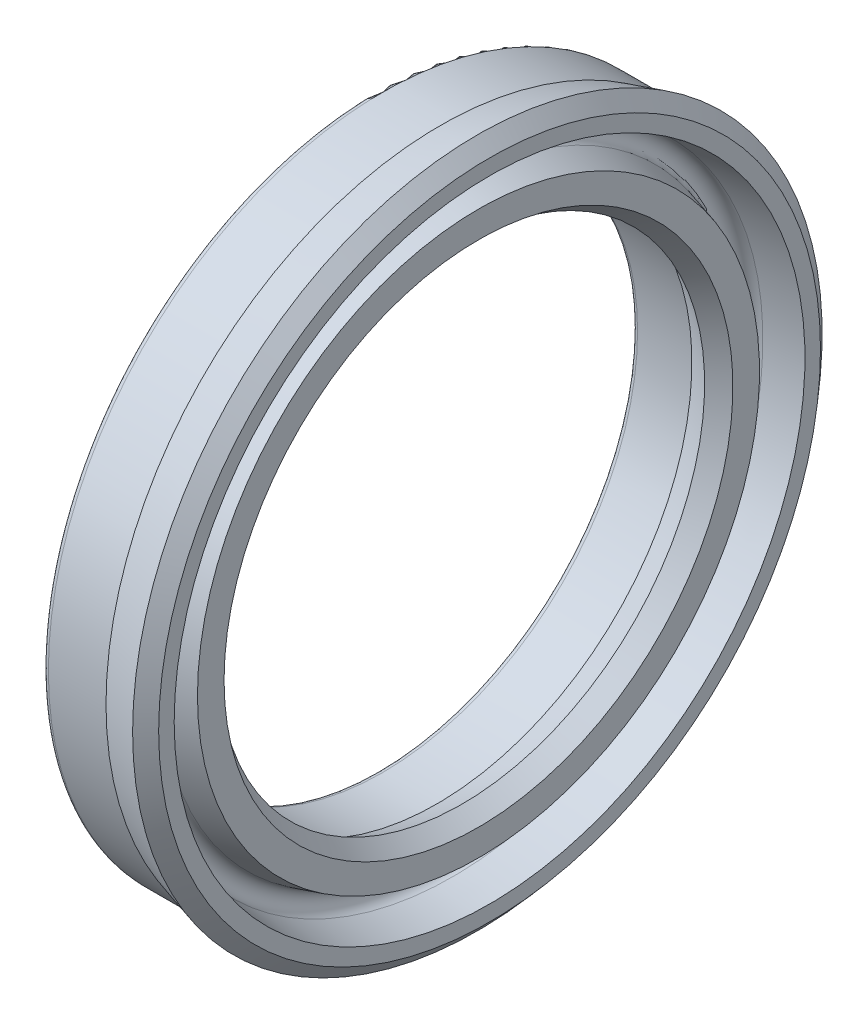
ISO-10303-21;
HEADER;
FILE_DESCRIPTION(('STEP AP214'),'2;1');
FILE_NAME('part.step','',(''),(''),'','','');
FILE_SCHEMA(('AUTOMOTIVE_DESIGN { 1 0 10303 214 1 1 1 1 }'));
ENDSEC;
DATA;
#1=APPLICATION_CONTEXT('core data for automotive mechanical design processes');
#2=APPLICATION_PROTOCOL_DEFINITION('international standard','automotive_design',2000,#1);
#3=PRODUCT_CONTEXT('',#1,'mechanical');
#4=PRODUCT('Part','Part','',(#3));
#5=PRODUCT_RELATED_PRODUCT_CATEGORY('part','',(#4));
#6=PRODUCT_DEFINITION_FORMATION('','',#4);
#7=PRODUCT_DEFINITION_CONTEXT('part definition',#1,'design');
#8=PRODUCT_DEFINITION('design','',#6,#7);
#9=PRODUCT_DEFINITION_SHAPE('','',#8);
#10=(LENGTH_UNIT() NAMED_UNIT(*) SI_UNIT(.MILLI.,.METRE.));
#11=(NAMED_UNIT(*) PLANE_ANGLE_UNIT() SI_UNIT($,.RADIAN.));
#12=(NAMED_UNIT(*) SI_UNIT($,.STERADIAN.) SOLID_ANGLE_UNIT());
#13=UNCERTAINTY_MEASURE_WITH_UNIT(LENGTH_MEASURE(1.E-05),#10,'distance_accuracy_value','');
#14=(GEOMETRIC_REPRESENTATION_CONTEXT(3) GLOBAL_UNCERTAINTY_ASSIGNED_CONTEXT((#13)) GLOBAL_UNIT_ASSIGNED_CONTEXT((#10,
#11,#12)) REPRESENTATION_CONTEXT('',''));
#15=CARTESIAN_POINT('',(0.,0.,0.));
#16=DIRECTION('',(0.,0.,1.));
#17=DIRECTION('',(1.,0.,0.));
#18=AXIS2_PLACEMENT_3D('',#15,#16,#17);
#19=CARTESIAN_POINT('',(6.81360939076159,0.,0.));
#20=DIRECTION('',(1.,0.,0.));
#21=DIRECTION('',(0.,0.,-1.));
#22=AXIS2_PLACEMENT_3D('',#19,#20,#21);
#23=CONICAL_SURFACE('',#22,27.9906551376294,0.136817054183385);
#24=CARTESIAN_POINT('',(10.1500000000001,0.,0.));
#25=DIRECTION('',(-1.,0.,0.));
#26=DIRECTION('',(0.,0.,1.));
#27=AXIS2_PLACEMENT_3D('',#24,#25,#26);
#28=CIRCLE('',#27,28.45);
#29=CARTESIAN_POINT('',(10.1500000000001,0.,28.4500000000001));
#30=VERTEX_POINT('',#29);
#31=EDGE_CURVE('E86',#30,#30,#28,.T.);
#32=ORIENTED_EDGE('',*,*,#31,.F.);
#33=EDGE_LOOP('',(#32));
#34=FACE_BOUND('',#33,.T.);
#35=CARTESIAN_POINT('',(6.81360939076159,0.,0.));
#36=DIRECTION('',(-1.,0.,0.));
#37=DIRECTION('',(0.,0.,1.));
#38=AXIS2_PLACEMENT_3D('',#35,#36,#37);
#39=CIRCLE('',#38,27.9906551376294);
#40=CARTESIAN_POINT('',(6.81360939076159,0.,27.9906551376295));
#41=VERTEX_POINT('',#40);
#42=EDGE_CURVE('E59',#41,#41,#39,.T.);
#43=ORIENTED_EDGE('',*,*,#42,.T.);
#44=EDGE_LOOP('',(#43));
#45=FACE_BOUND('',#44,.T.);
#46=ADVANCED_FACE('F39',(#34,#45),#23,.F.);
#47=CARTESIAN_POINT('',(6.95000000000002,0.,0.));
#48=DIRECTION('',(-1.,0.,0.));
#49=DIRECTION('',(0.,0.,1.));
#50=AXIS2_PLACEMENT_3D('',#47,#48,#49);
#51=TOROIDAL_SURFACE('',#50,27.,1.);
#52=ORIENTED_EDGE('',*,*,#42,.F.);
#53=EDGE_LOOP('',(#52));
#54=FACE_BOUND('',#53,.T.);
#55=CARTESIAN_POINT('',(6.68198450367497,0.,0.));
#56=DIRECTION('',(-1.,0.,0.));
#57=DIRECTION('',(0.,0.,1.));
#58=AXIS2_PLACEMENT_3D('',#55,#56,#57);
#59=CIRCLE('',#58,26.0365853988393);
#60=CARTESIAN_POINT('',(6.68198450367497,0.,26.0365853988394));
#61=VERTEX_POINT('',#60);
#62=EDGE_CURVE('E62',#61,#61,#59,.T.);
#63=ORIENTED_EDGE('',*,*,#62,.T.);
#64=EDGE_LOOP('',(#63));
#65=FACE_BOUND('',#64,.T.);
#66=ADVANCED_FACE('F94',(#54,#65),#51,.F.);
#67=CARTESIAN_POINT('',(9.15,0.,0.));
#68=DIRECTION('',(-1.,0.,0.));
#69=DIRECTION('',(0.,0.,1.));
#70=AXIS2_PLACEMENT_3D('',#67,#68,#69);
#71=CONICAL_SURFACE('',#70,25.35,0.271332574832958);
#72=ORIENTED_EDGE('',*,*,#62,.F.);
#73=EDGE_LOOP('',(#72));
#74=FACE_BOUND('',#73,.T.);
#75=CARTESIAN_POINT('',(9.15,0.,0.));
#76=DIRECTION('',(-1.,0.,0.));
#77=DIRECTION('',(0.,0.,1.));
#78=AXIS2_PLACEMENT_3D('',#75,#76,#77);
#79=CIRCLE('',#78,25.35);
#80=CARTESIAN_POINT('',(9.15,0.,25.3500000000001));
#81=VERTEX_POINT('',#80);
#82=EDGE_CURVE('E65',#81,#81,#79,.T.);
#83=ORIENTED_EDGE('',*,*,#82,.T.);
#84=EDGE_LOOP('',(#83));
#85=FACE_BOUND('',#84,.T.);
#86=ADVANCED_FACE('F100',(#74,#85),#71,.T.);
#87=CARTESIAN_POINT('',(9.14999999999999,25.3499999999996,2.77555756156289E-13));
#88=DIRECTION('',(-1.,0.,0.));
#89=DIRECTION('',(0.,0.,1.));
#90=AXIS2_PLACEMENT_3D('',#87,#88,#89);
#91=PLANE('',#90);
#92=ORIENTED_EDGE('',*,*,#82,.F.);
#93=EDGE_LOOP('',(#92));
#94=FACE_BOUND('',#93,.T.);
#95=CARTESIAN_POINT('',(9.15,0.,0.));
#96=DIRECTION('',(-1.,0.,0.));
#97=DIRECTION('',(0.,0.,1.));
#98=AXIS2_PLACEMENT_3D('',#95,#96,#97);
#99=CIRCLE('',#98,22.95);
#100=CARTESIAN_POINT('',(9.15,0.,22.95));
#101=VERTEX_POINT('',#100);
#102=EDGE_CURVE('E68',#101,#101,#99,.T.);
#103=ORIENTED_EDGE('',*,*,#102,.T.);
#104=EDGE_LOOP('',(#103));
#105=FACE_BOUND('',#104,.T.);
#106=ADVANCED_FACE('F106',(#94,#105),#91,.F.);
#107=CARTESIAN_POINT('',(7.64999999999994,0.,0.));
#108=DIRECTION('',(1.,0.,0.));
#109=DIRECTION('',(0.,0.,-1.));
#110=AXIS2_PLACEMENT_3D('',#107,#108,#109);
#111=CONICAL_SURFACE('',#110,21.9,0.610725964389208);
#112=ORIENTED_EDGE('',*,*,#102,.F.);
#113=EDGE_LOOP('',(#112));
#114=FACE_BOUND('',#113,.T.);
#115=CARTESIAN_POINT('',(7.64999999999994,0.,0.));
#116=DIRECTION('',(-1.,0.,0.));
#117=DIRECTION('',(0.,0.,1.));
#118=AXIS2_PLACEMENT_3D('',#115,#116,#117);
#119=CIRCLE('',#118,21.9);
#120=CARTESIAN_POINT('',(7.64999999999994,0.,21.9));
#121=VERTEX_POINT('',#120);
#122=EDGE_CURVE('E71',#121,#121,#119,.T.);
#123=ORIENTED_EDGE('',*,*,#122,.T.);
#124=EDGE_LOOP('',(#123));
#125=FACE_BOUND('',#124,.T.);
#126=ADVANCED_FACE('F112',(#114,#125),#111,.F.);
#127=CARTESIAN_POINT('',(5.40000000000007,0.,0.));
#128=DIRECTION('',(-1.,0.,0.));
#129=DIRECTION('',(0.,0.,1.));
#130=AXIS2_PLACEMENT_3D('',#127,#128,#129);
#131=CONICAL_SURFACE('',#130,23.,0.454719274820968);
#132=ORIENTED_EDGE('',*,*,#122,.F.);
#133=EDGE_LOOP('',(#132));
#134=FACE_BOUND('',#133,.T.);
#135=CARTESIAN_POINT('',(5.40000000000007,0.,0.));
#136=DIRECTION('',(-1.,0.,0.));
#137=DIRECTION('',(0.,0.,1.));
#138=AXIS2_PLACEMENT_3D('',#135,#136,#137);
#139=CIRCLE('',#138,23.);
#140=CARTESIAN_POINT('',(5.40000000000007,0.,23.0000000000001));
#141=VERTEX_POINT('',#140);
#142=EDGE_CURVE('E74',#141,#141,#139,.T.);
#143=ORIENTED_EDGE('',*,*,#142,.T.);
#144=EDGE_LOOP('',(#143));
#145=FACE_BOUND('',#144,.T.);
#146=ADVANCED_FACE('F118',(#134,#145),#131,.F.);
#147=CARTESIAN_POINT('',(0.,0.,0.));
#148=DIRECTION('',(-1.,0.,0.));
#149=DIRECTION('',(0.,0.,1.));
#150=AXIS2_PLACEMENT_3D('',#147,#148,#149);
#151=CYLINDRICAL_SURFACE('',#150,23.);
#152=CARTESIAN_POINT('',(0.499999999999945,0.,0.));
#153=DIRECTION('',(1.,0.,0.));
#154=DIRECTION('',(0.,0.,-1.));
#155=AXIS2_PLACEMENT_3D('',#152,#153,#154);
#156=CIRCLE('',#155,23.);
#157=CARTESIAN_POINT('',(0.499999999999945,0.,-23.0000000000001));
#158=VERTEX_POINT('',#157);
#159=EDGE_CURVE('E54',#158,#158,#156,.F.);
#160=ORIENTED_EDGE('',*,*,#159,.T.);
#161=EDGE_LOOP('',(#160));
#162=FACE_BOUND('',#161,.T.);
#163=ORIENTED_EDGE('',*,*,#142,.F.);
#164=EDGE_LOOP('',(#163));
#165=FACE_BOUND('',#164,.T.);
#166=ADVANCED_FACE('F124',(#162,#165),#151,.F.);
#167=CARTESIAN_POINT('',(0.,22.9999999999999,3.33066907387547E-13));
#168=DIRECTION('',(1.,0.,0.));
#169=DIRECTION('',(0.,0.,-1.));
#170=AXIS2_PLACEMENT_3D('',#167,#168,#169);
#171=PLANE('',#170);
#172=CARTESIAN_POINT('',(0.,0.,0.));
#173=DIRECTION('',(1.,0.,0.));
#174=DIRECTION('',(0.,0.,-1.));
#175=AXIS2_PLACEMENT_3D('',#172,#173,#174);
#176=CIRCLE('',#175,23.5);
#177=CARTESIAN_POINT('',(0.,0.,-23.5000000000001));
#178=VERTEX_POINT('',#177);
#179=EDGE_CURVE('E46',#178,#178,#176,.T.);
#180=ORIENTED_EDGE('',*,*,#179,.T.);
#181=EDGE_LOOP('',(#180));
#182=FACE_BOUND('',#181,.T.);
#183=CARTESIAN_POINT('',(0.,0.,0.));
#184=DIRECTION('',(1.,0.,0.));
#185=DIRECTION('',(0.,0.,-1.));
#186=AXIS2_PLACEMENT_3D('',#183,#184,#185);
#187=CIRCLE('',#186,29.65);
#188=CARTESIAN_POINT('',(0.,0.,-29.6500000000001));
#189=VERTEX_POINT('',#188);
#190=EDGE_CURVE('E50',#189,#189,#187,.F.);
#191=ORIENTED_EDGE('',*,*,#190,.T.);
#192=EDGE_LOOP('',(#191));
#193=FACE_BOUND('',#192,.T.);
#194=ADVANCED_FACE('F129',(#182,#193),#171,.F.);
#195=CARTESIAN_POINT('',(0.,0.,0.));
#196=DIRECTION('',(-1.,0.,0.));
#197=DIRECTION('',(0.,0.,1.));
#198=AXIS2_PLACEMENT_3D('',#195,#196,#197);
#199=CYLINDRICAL_SURFACE('',#198,30.15);
#200=CARTESIAN_POINT('',(0.499999999999945,0.,0.));
#201=DIRECTION('',(1.,0.,0.));
#202=DIRECTION('',(0.,0.,-1.));
#203=AXIS2_PLACEMENT_3D('',#200,#201,#202);
#204=CIRCLE('',#203,30.15);
#205=CARTESIAN_POINT('',(0.499999999999945,0.,-30.1500000000001));
#206=VERTEX_POINT('',#205);
#207=EDGE_CURVE('E10',#206,#206,#204,.T.);
#208=ORIENTED_EDGE('',*,*,#207,.T.);
#209=EDGE_LOOP('',(#208));
#210=FACE_BOUND('',#209,.T.);
#211=CARTESIAN_POINT('',(5.70000000000004,0.,0.));
#212=DIRECTION('',(-1.,0.,0.));
#213=DIRECTION('',(0.,0.,1.));
#214=AXIS2_PLACEMENT_3D('',#211,#212,#213);
#215=CIRCLE('',#214,30.15);
#216=CARTESIAN_POINT('',(5.70000000000004,0.,30.1500000000001));
#217=VERTEX_POINT('',#216);
#218=EDGE_CURVE('E77',#217,#217,#215,.T.);
#219=ORIENTED_EDGE('',*,*,#218,.T.);
#220=EDGE_LOOP('',(#219));
#221=FACE_BOUND('',#220,.T.);
#222=ADVANCED_FACE('F135',(#210,#221),#199,.T.);
#223=CARTESIAN_POINT('',(9.05000000000001,0.,0.));
#224=DIRECTION('',(1.,0.,0.));
#225=DIRECTION('',(0.,0.,-1.));
#226=AXIS2_PLACEMENT_3D('',#223,#224,#225);
#227=CONICAL_SURFACE('',#226,31.1,0.276327274975065);
#228=ORIENTED_EDGE('',*,*,#218,.F.);
#229=EDGE_LOOP('',(#228));
#230=FACE_BOUND('',#229,.T.);
#231=CARTESIAN_POINT('',(9.05000000000001,0.,0.));
#232=DIRECTION('',(-1.,0.,0.));
#233=DIRECTION('',(0.,0.,1.));
#234=AXIS2_PLACEMENT_3D('',#231,#232,#233);
#235=CIRCLE('',#234,31.1);
#236=CARTESIAN_POINT('',(9.05000000000001,0.,31.1000000000001));
#237=VERTEX_POINT('',#236);
#238=EDGE_CURVE('E80',#237,#237,#235,.T.);
#239=ORIENTED_EDGE('',*,*,#238,.T.);
#240=EDGE_LOOP('',(#239));
#241=FACE_BOUND('',#240,.T.);
#242=ADVANCED_FACE('F154',(#230,#241),#227,.T.);
#243=CARTESIAN_POINT('',(10.1500000000001,0.,0.));
#244=DIRECTION('',(-1.,0.,0.));
#245=DIRECTION('',(0.,0.,1.));
#246=AXIS2_PLACEMENT_3D('',#243,#244,#245);
#247=CONICAL_SURFACE('',#246,29.85,0.849141475930137);
#248=ORIENTED_EDGE('',*,*,#238,.F.);
#249=EDGE_LOOP('',(#248));
#250=FACE_BOUND('',#249,.T.);
#251=CARTESIAN_POINT('',(10.1500000000001,0.,0.));
#252=DIRECTION('',(-1.,0.,0.));
#253=DIRECTION('',(0.,0.,1.));
#254=AXIS2_PLACEMENT_3D('',#251,#252,#253);
#255=CIRCLE('',#254,29.85);
#256=CARTESIAN_POINT('',(10.1500000000001,0.,29.8500000000001));
#257=VERTEX_POINT('',#256);
#258=EDGE_CURVE('E83',#257,#257,#255,.T.);
#259=ORIENTED_EDGE('',*,*,#258,.T.);
#260=EDGE_LOOP('',(#259));
#261=FACE_BOUND('',#260,.T.);
#262=ADVANCED_FACE('F146',(#250,#261),#247,.T.);
#263=CARTESIAN_POINT('',(10.1500000000001,29.8499999999995,2.77555756156289E-13));
#264=DIRECTION('',(-1.,0.,0.));
#265=DIRECTION('',(0.,0.,1.));
#266=AXIS2_PLACEMENT_3D('',#263,#264,#265);
#267=PLANE('',#266);
#268=ORIENTED_EDGE('',*,*,#258,.F.);
#269=EDGE_LOOP('',(#268));
#270=FACE_BOUND('',#269,.T.);
#271=ORIENTED_EDGE('',*,*,#31,.T.);
#272=EDGE_LOOP('',(#271));
#273=FACE_BOUND('',#272,.T.);
#274=ADVANCED_FACE('F90',(#270,#273),#267,.F.);
#275=CARTESIAN_POINT('',(0.499999999999945,0.,0.));
#276=DIRECTION('',(1.,0.,0.));
#277=DIRECTION('',(0.,0.,-1.));
#278=AXIS2_PLACEMENT_3D('',#275,#276,#277);
#279=TOROIDAL_SURFACE('',#278,23.5,0.5);
#280=ORIENTED_EDGE('',*,*,#179,.F.);
#281=EDGE_LOOP('',(#280));
#282=FACE_BOUND('',#281,.T.);
#283=ORIENTED_EDGE('',*,*,#159,.F.);
#284=EDGE_LOOP('',(#283));
#285=FACE_BOUND('',#284,.T.);
#286=ADVANCED_FACE('F138',(#282,#285),#279,.T.);
#287=CARTESIAN_POINT('',(0.499999999999945,0.,0.));
#288=DIRECTION('',(1.,0.,0.));
#289=DIRECTION('',(0.,0.,-1.));
#290=AXIS2_PLACEMENT_3D('',#287,#288,#289);
#291=TOROIDAL_SURFACE('',#290,29.65,0.5);
#292=ORIENTED_EDGE('',*,*,#207,.F.);
#293=EDGE_LOOP('',(#292));
#294=FACE_BOUND('',#293,.T.);
#295=ORIENTED_EDGE('',*,*,#190,.F.);
#296=EDGE_LOOP('',(#295));
#297=FACE_BOUND('',#296,.T.);
#298=ADVANCED_FACE('F41',(#294,#297),#291,.T.);
#299=CLOSED_SHELL('',(#46,#66,#86,#106,#126,#146,#166,#194,#222,#242,#262,#274,#286,#298));
#300=MANIFOLD_SOLID_BREP('B2',#299);
#301=ADVANCED_BREP_SHAPE_REPRESENTATION('',(#18,#300),#14);
#302=SHAPE_DEFINITION_REPRESENTATION(#9,#301);
ENDSEC;
END-ISO-10303-21;
